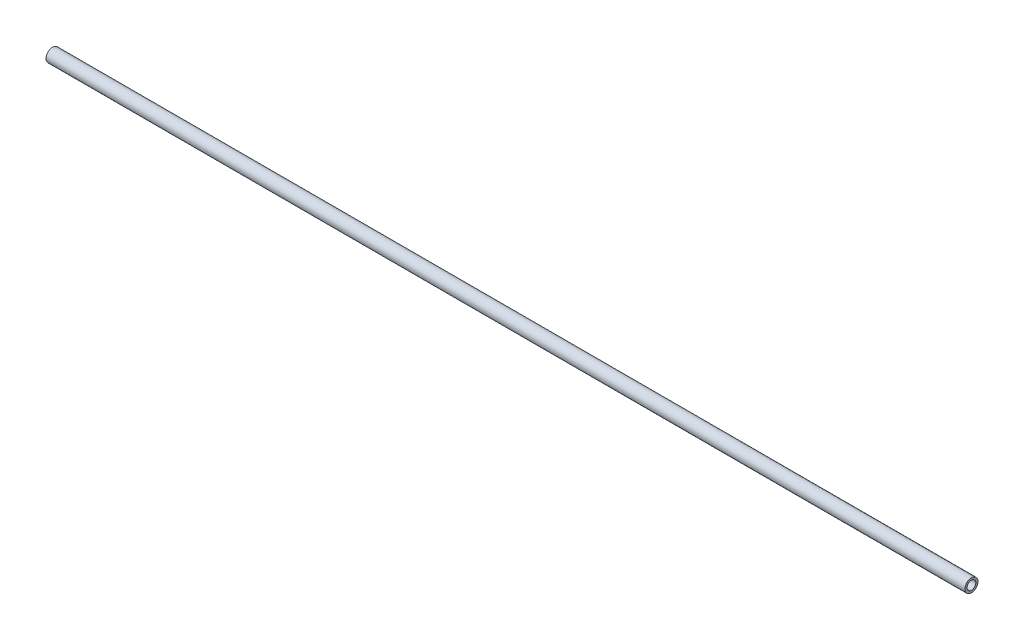
ISO-10303-21;
HEADER;
FILE_DESCRIPTION(('STEP AP214'),'2;1');
FILE_NAME('part.step','',(''),(''),'','','');
FILE_SCHEMA(('AUTOMOTIVE_DESIGN { 1 0 10303 214 1 1 1 1 }'));
ENDSEC;
DATA;
#1=APPLICATION_CONTEXT('core data for automotive mechanical design processes');
#2=APPLICATION_PROTOCOL_DEFINITION('international standard','automotive_design',2000,#1);
#3=PRODUCT_CONTEXT('',#1,'mechanical');
#4=PRODUCT('Part','Part','',(#3));
#5=PRODUCT_RELATED_PRODUCT_CATEGORY('part','',(#4));
#6=PRODUCT_DEFINITION_FORMATION('','',#4);
#7=PRODUCT_DEFINITION_CONTEXT('part definition',#1,'design');
#8=PRODUCT_DEFINITION('design','',#6,#7);
#9=PRODUCT_DEFINITION_SHAPE('','',#8);
#10=(LENGTH_UNIT() NAMED_UNIT(*) SI_UNIT(.MILLI.,.METRE.));
#11=(NAMED_UNIT(*) PLANE_ANGLE_UNIT() SI_UNIT($,.RADIAN.));
#12=(NAMED_UNIT(*) SI_UNIT($,.STERADIAN.) SOLID_ANGLE_UNIT());
#13=UNCERTAINTY_MEASURE_WITH_UNIT(LENGTH_MEASURE(1.E-05),#10,'distance_accuracy_value','');
#14=(GEOMETRIC_REPRESENTATION_CONTEXT(3) GLOBAL_UNCERTAINTY_ASSIGNED_CONTEXT((#13)) GLOBAL_UNIT_ASSIGNED_CONTEXT((#10,
#11,#12)) REPRESENTATION_CONTEXT('',''));
#15=CARTESIAN_POINT('',(0.,0.,0.));
#16=DIRECTION('',(0.,0.,1.));
#17=DIRECTION('',(1.,0.,0.));
#18=AXIS2_PLACEMENT_3D('',#15,#16,#17);
#19=CARTESIAN_POINT('',(-211.,0.,-98.));
#20=DIRECTION('',(-1.,0.,0.));
#21=DIRECTION('',(0.,1.,0.));
#22=AXIS2_PLACEMENT_3D('',#19,#20,#21);
#23=CYLINDRICAL_SURFACE('',#22,2.);
#24=CARTESIAN_POINT('',(-210.,0.,-98.));
#25=DIRECTION('',(-1.,0.,0.));
#26=DIRECTION('',(0.,1.,0.));
#27=AXIS2_PLACEMENT_3D('',#24,#25,#26);
#28=CIRCLE('',#27,2.);
#29=CARTESIAN_POINT('',(-210.,2.,-98.));
#30=VERTEX_POINT('',#29);
#31=EDGE_CURVE('E63',#30,#30,#28,.T.);
#32=ORIENTED_EDGE('',*,*,#31,.T.);
#33=DIRECTION('',(1.,0.,0.));
#34=VECTOR('',#33,1.);
#35=CARTESIAN_POINT('',(-211.,2.,-98.));
#36=LINE('',#35,#34);
#37=CARTESIAN_POINT('',(210.,2.,-98.));
#38=VERTEX_POINT('',#37);
#39=EDGE_CURVE('E11',#30,#38,#36,.T.);
#40=ORIENTED_EDGE('',*,*,#39,.T.);
#41=CARTESIAN_POINT('',(210.,0.,-98.));
#42=DIRECTION('',(-1.,0.,0.));
#43=DIRECTION('',(0.,1.,0.));
#44=AXIS2_PLACEMENT_3D('',#41,#42,#43);
#45=CIRCLE('',#44,2.);
#46=EDGE_CURVE('E20',#38,#38,#45,.T.);
#47=ORIENTED_EDGE('',*,*,#46,.F.);
#48=ORIENTED_EDGE('',*,*,#39,.F.);
#49=EDGE_LOOP('',(#32,#40,#47,#48));
#50=FACE_BOUND('',#49,.T.);
#51=ADVANCED_FACE('F17',(#50),#23,.F.);
#52=CARTESIAN_POINT('',(210.,0.,-98.));
#53=DIRECTION('',(1.,0.,0.));
#54=DIRECTION('',(0.,1.,0.));
#55=AXIS2_PLACEMENT_3D('',#52,#53,#54);
#56=PLANE('',#55);
#57=ORIENTED_EDGE('',*,*,#46,.T.);
#58=EDGE_LOOP('',(#57));
#59=FACE_BOUND('',#58,.T.);
#60=CARTESIAN_POINT('',(210.,0.,-98.));
#61=DIRECTION('',(1.,0.,0.));
#62=DIRECTION('',(0.,1.,0.));
#63=AXIS2_PLACEMENT_3D('',#60,#61,#62);
#64=CIRCLE('',#63,3.);
#65=CARTESIAN_POINT('',(210.,3.,-98.));
#66=VERTEX_POINT('',#65);
#67=EDGE_CURVE('E47',#66,#66,#64,.T.);
#68=ORIENTED_EDGE('',*,*,#67,.T.);
#69=EDGE_LOOP('',(#68));
#70=FACE_BOUND('',#69,.T.);
#71=ADVANCED_FACE('F73',(#59,#70),#56,.T.);
#72=CARTESIAN_POINT('',(-210.,0.,-98.));
#73=DIRECTION('',(1.,0.,0.));
#74=DIRECTION('',(0.,1.,0.));
#75=AXIS2_PLACEMENT_3D('',#72,#73,#74);
#76=PLANE('',#75);
#77=ORIENTED_EDGE('',*,*,#31,.F.);
#78=EDGE_LOOP('',(#77));
#79=FACE_BOUND('',#78,.T.);
#80=CARTESIAN_POINT('',(-210.,0.,-98.));
#81=DIRECTION('',(1.,0.,0.));
#82=DIRECTION('',(0.,1.,0.));
#83=AXIS2_PLACEMENT_3D('',#80,#81,#82);
#84=CIRCLE('',#83,3.);
#85=CARTESIAN_POINT('',(-210.,3.,-98.));
#86=VERTEX_POINT('',#85);
#87=EDGE_CURVE('E57',#86,#86,#84,.T.);
#88=ORIENTED_EDGE('',*,*,#87,.F.);
#89=EDGE_LOOP('',(#88));
#90=FACE_BOUND('',#89,.T.);
#91=ADVANCED_FACE('F79',(#79,#90),#76,.F.);
#92=CARTESIAN_POINT('',(-210.,0.,-98.));
#93=DIRECTION('',(-1.,0.,0.));
#94=DIRECTION('',(0.,1.,0.));
#95=AXIS2_PLACEMENT_3D('',#92,#93,#94);
#96=CYLINDRICAL_SURFACE('',#95,3.);
#97=ORIENTED_EDGE('',*,*,#87,.T.);
#98=DIRECTION('',(1.,0.,0.));
#99=VECTOR('',#98,1.);
#100=CARTESIAN_POINT('',(-210.,3.,-98.));
#101=LINE('',#100,#99);
#102=EDGE_CURVE('E54',#86,#66,#101,.T.);
#103=ORIENTED_EDGE('',*,*,#102,.T.);
#104=ORIENTED_EDGE('',*,*,#67,.F.);
#105=ORIENTED_EDGE('',*,*,#102,.F.);
#106=EDGE_LOOP('',(#97,#103,#104,#105));
#107=FACE_BOUND('',#106,.T.);
#108=ADVANCED_FACE('F55',(#107),#96,.T.);
#109=CLOSED_SHELL('',(#51,#71,#91,#108));
#110=MANIFOLD_SOLID_BREP('B1',#109);
#111=ADVANCED_BREP_SHAPE_REPRESENTATION('',(#18,#110),#14);
#112=SHAPE_DEFINITION_REPRESENTATION(#9,#111);
ENDSEC;
END-ISO-10303-21;
